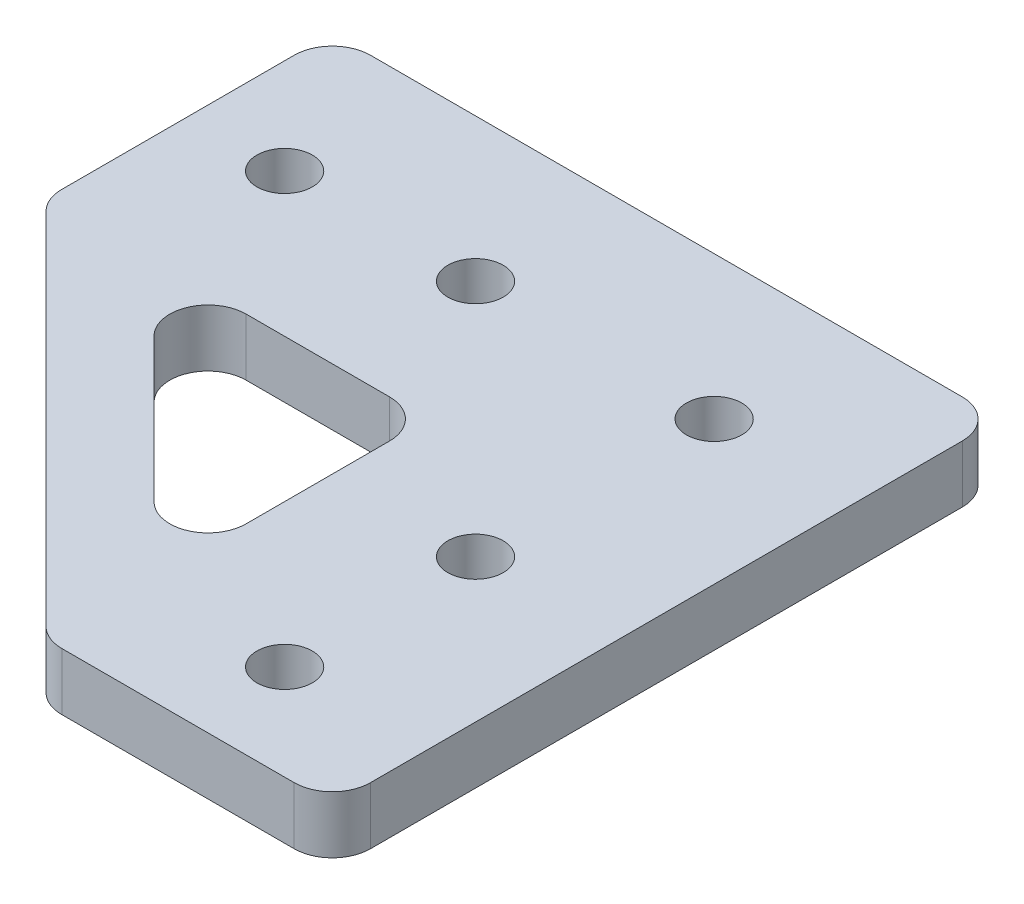
ISO-10303-21;
HEADER;
FILE_DESCRIPTION(('STEP AP214'),'2;1');
FILE_NAME('part.step','',(''),(''),'','','');
FILE_SCHEMA(('AUTOMOTIVE_DESIGN { 1 0 10303 214 1 1 1 1 }'));
ENDSEC;
DATA;
#1=APPLICATION_CONTEXT('core data for automotive mechanical design processes');
#2=APPLICATION_PROTOCOL_DEFINITION('international standard','automotive_design',2000,#1);
#3=PRODUCT_CONTEXT('',#1,'mechanical');
#4=PRODUCT('Part','Part','',(#3));
#5=PRODUCT_RELATED_PRODUCT_CATEGORY('part','',(#4));
#6=PRODUCT_DEFINITION_FORMATION('','',#4);
#7=PRODUCT_DEFINITION_CONTEXT('part definition',#1,'design');
#8=PRODUCT_DEFINITION('design','',#6,#7);
#9=PRODUCT_DEFINITION_SHAPE('','',#8);
#10=(LENGTH_UNIT() NAMED_UNIT(*) SI_UNIT(.MILLI.,.METRE.));
#11=(NAMED_UNIT(*) PLANE_ANGLE_UNIT() SI_UNIT($,.RADIAN.));
#12=(NAMED_UNIT(*) SI_UNIT($,.STERADIAN.) SOLID_ANGLE_UNIT());
#13=UNCERTAINTY_MEASURE_WITH_UNIT(LENGTH_MEASURE(1.E-05),#10,'distance_accuracy_value','');
#14=(GEOMETRIC_REPRESENTATION_CONTEXT(3) GLOBAL_UNCERTAINTY_ASSIGNED_CONTEXT((#13)) GLOBAL_UNIT_ASSIGNED_CONTEXT((#10,
#11,#12)) REPRESENTATION_CONTEXT('',''));
#15=CARTESIAN_POINT('',(0.,0.,0.));
#16=DIRECTION('',(0.,0.,1.));
#17=DIRECTION('',(1.,0.,0.));
#18=AXIS2_PLACEMENT_3D('',#15,#16,#17);
#19=CARTESIAN_POINT('',(0.,3.,0.));
#20=DIRECTION('',(0.,-1.,0.));
#21=DIRECTION('',(0.,0.,-1.));
#22=AXIS2_PLACEMENT_3D('',#19,#20,#21);
#23=PLANE('',#22);
#24=DIRECTION('',(0.,0.,1.));
#25=VECTOR('',#24,1.);
#26=CARTESIAN_POINT('',(-15.,3.,35.));
#27=LINE('',#26,#25);
#28=CARTESIAN_POINT('',(-15.,3.,17.));
#29=VERTEX_POINT('',#28);
#30=CARTESIAN_POINT('',(-15.,3.,24.5147186257614));
#31=VERTEX_POINT('',#30);
#32=EDGE_CURVE('E267',#29,#31,#27,.T.);
#33=ORIENTED_EDGE('',*,*,#32,.T.);
#34=CARTESIAN_POINT('',(-17.,3.,24.5147186257614));
#35=DIRECTION('',(0.,-1.,0.));
#36=DIRECTION('',(0.,0.,-1.));
#37=AXIS2_PLACEMENT_3D('',#34,#35,#36);
#38=CIRCLE('',#37,2.);
#39=CARTESIAN_POINT('',(-18.4142135623731,3.,25.9289321881345));
#40=VERTEX_POINT('',#39);
#41=EDGE_CURVE('E241',#31,#40,#38,.T.);
#42=ORIENTED_EDGE('',*,*,#41,.T.);
#43=DIRECTION('',(-0.707106781186548,0.,-0.707106781186547));
#44=VECTOR('',#43,1.);
#45=CARTESIAN_POINT('',(-15.,3.,29.3431457505076));
#46=LINE('',#45,#44);
#47=CARTESIAN_POINT('',(-25.9289321881345,3.,18.4142135623731));
#48=VERTEX_POINT('',#47);
#49=EDGE_CURVE('E298',#40,#48,#46,.T.);
#50=ORIENTED_EDGE('',*,*,#49,.T.);
#51=CARTESIAN_POINT('',(-24.5147186257614,3.,17.));
#52=DIRECTION('',(0.,-1.,0.));
#53=DIRECTION('',(0.,0.,-1.));
#54=AXIS2_PLACEMENT_3D('',#51,#52,#53);
#55=CIRCLE('',#54,2.);
#56=CARTESIAN_POINT('',(-24.5147186257614,3.,15.));
#57=VERTEX_POINT('',#56);
#58=EDGE_CURVE('E245',#48,#57,#55,.T.);
#59=ORIENTED_EDGE('',*,*,#58,.T.);
#60=DIRECTION('',(1.,0.,0.));
#61=VECTOR('',#60,1.);
#62=CARTESIAN_POINT('',(-35.,3.,15.));
#63=LINE('',#62,#61);
#64=CARTESIAN_POINT('',(-17.,3.,15.));
#65=VERTEX_POINT('',#64);
#66=EDGE_CURVE('E268',#57,#65,#63,.T.);
#67=ORIENTED_EDGE('',*,*,#66,.T.);
#68=CARTESIAN_POINT('',(-17.,3.,17.));
#69=DIRECTION('',(0.,-1.,0.));
#70=DIRECTION('',(0.,0.,-1.));
#71=AXIS2_PLACEMENT_3D('',#68,#69,#70);
#72=CIRCLE('',#71,2.);
#73=EDGE_CURVE('E11',#65,#29,#72,.T.);
#74=ORIENTED_EDGE('',*,*,#73,.T.);
#75=EDGE_LOOP('',(#33,#42,#50,#59,#67,#74));
#76=FACE_BOUND('',#75,.T.);
#77=DIRECTION('',(0.707106781186548,0.,0.707106781186547));
#78=VECTOR('',#77,1.);
#79=CARTESIAN_POINT('',(-35.,3.,15.));
#80=LINE('',#79,#78);
#81=CARTESIAN_POINT('',(-34.4142135623731,3.,15.5857864376269));
#82=VERTEX_POINT('',#81);
#83=CARTESIAN_POINT('',(-15.5857864376269,3.,34.4142135623731));
#84=VERTEX_POINT('',#83);
#85=EDGE_CURVE('E295',#82,#84,#80,.T.);
#86=ORIENTED_EDGE('',*,*,#85,.T.);
#87=CARTESIAN_POINT('',(-14.1715728752538,3.,33.));
#88=DIRECTION('',(0.,-1.,0.));
#89=DIRECTION('',(0.,0.,-1.));
#90=AXIS2_PLACEMENT_3D('',#87,#88,#89);
#91=CIRCLE('',#90,2.);
#92=CARTESIAN_POINT('',(-14.1715728752538,3.,35.));
#93=VERTEX_POINT('',#92);
#94=EDGE_CURVE('E210',#84,#93,#91,.F.);
#95=ORIENTED_EDGE('',*,*,#94,.T.);
#96=DIRECTION('',(1.,0.,0.));
#97=VECTOR('',#96,1.);
#98=CARTESIAN_POINT('',(0.,3.,35.));
#99=LINE('',#98,#97);
#100=CARTESIAN_POINT('',(-2.,3.,35.));
#101=VERTEX_POINT('',#100);
#102=EDGE_CURVE('E175',#93,#101,#99,.T.);
#103=ORIENTED_EDGE('',*,*,#102,.T.);
#104=CARTESIAN_POINT('',(-2.,3.,33.));
#105=DIRECTION('',(0.,-1.,0.));
#106=DIRECTION('',(0.,0.,-1.));
#107=AXIS2_PLACEMENT_3D('',#104,#105,#106);
#108=CIRCLE('',#107,2.);
#109=CARTESIAN_POINT('',(0.,3.,33.));
#110=VERTEX_POINT('',#109);
#111=EDGE_CURVE('E203',#101,#110,#108,.F.);
#112=ORIENTED_EDGE('',*,*,#111,.T.);
#113=DIRECTION('',(0.,0.,-1.));
#114=VECTOR('',#113,1.);
#115=CARTESIAN_POINT('',(0.,3.,0.));
#116=LINE('',#115,#114);
#117=CARTESIAN_POINT('',(0.,3.,2.));
#118=VERTEX_POINT('',#117);
#119=EDGE_CURVE('E182',#110,#118,#116,.T.);
#120=ORIENTED_EDGE('',*,*,#119,.T.);
#121=CARTESIAN_POINT('',(-2.,3.,2.));
#122=DIRECTION('',(0.,-1.,0.));
#123=DIRECTION('',(0.,0.,-1.));
#124=AXIS2_PLACEMENT_3D('',#121,#122,#123);
#125=CIRCLE('',#124,2.);
#126=CARTESIAN_POINT('',(-2.,3.,0.));
#127=VERTEX_POINT('',#126);
#128=EDGE_CURVE('E205',#118,#127,#125,.F.);
#129=ORIENTED_EDGE('',*,*,#128,.T.);
#130=DIRECTION('',(-1.,0.,0.));
#131=VECTOR('',#130,1.);
#132=CARTESIAN_POINT('',(0.,3.,0.));
#133=LINE('',#132,#131);
#134=CARTESIAN_POINT('',(-33.,3.,0.));
#135=VERTEX_POINT('',#134);
#136=EDGE_CURVE('E186',#127,#135,#133,.T.);
#137=ORIENTED_EDGE('',*,*,#136,.T.);
#138=CARTESIAN_POINT('',(-33.,3.,2.));
#139=DIRECTION('',(0.,-1.,0.));
#140=DIRECTION('',(0.,0.,-1.));
#141=AXIS2_PLACEMENT_3D('',#138,#139,#140);
#142=CIRCLE('',#141,2.);
#143=CARTESIAN_POINT('',(-35.,3.,2.));
#144=VERTEX_POINT('',#143);
#145=EDGE_CURVE('E63',#135,#144,#142,.F.);
#146=ORIENTED_EDGE('',*,*,#145,.T.);
#147=DIRECTION('',(0.,0.,1.));
#148=VECTOR('',#147,1.);
#149=CARTESIAN_POINT('',(-35.,3.,0.));
#150=LINE('',#149,#148);
#151=CARTESIAN_POINT('',(-35.,3.,14.1715728752538));
#152=VERTEX_POINT('',#151);
#153=EDGE_CURVE('E274',#144,#152,#150,.T.);
#154=ORIENTED_EDGE('',*,*,#153,.T.);
#155=CARTESIAN_POINT('',(-33.,3.,14.1715728752538));
#156=DIRECTION('',(0.,-1.,0.));
#157=DIRECTION('',(0.,0.,-1.));
#158=AXIS2_PLACEMENT_3D('',#155,#156,#157);
#159=CIRCLE('',#158,2.);
#160=EDGE_CURVE('E208',#152,#82,#159,.F.);
#161=ORIENTED_EDGE('',*,*,#160,.T.);
#162=EDGE_LOOP('',(#86,#95,#103,#112,#120,#129,#137,#146,#154,#161));
#163=FACE_BOUND('',#162,.T.);
#164=CARTESIAN_POINT('',(-7.50000000000001,3.,7.5));
#165=DIRECTION('',(0.,1.,0.));
#166=DIRECTION('',(0.,0.,1.));
#167=AXIS2_PLACEMENT_3D('',#164,#165,#166);
#168=CIRCLE('',#167,1.45);
#169=CARTESIAN_POINT('',(-7.50000000000001,3.,8.95));
#170=VERTEX_POINT('',#169);
#171=EDGE_CURVE('E282',#170,#170,#168,.T.);
#172=ORIENTED_EDGE('',*,*,#171,.F.);
#173=EDGE_LOOP('',(#172));
#174=FACE_BOUND('',#173,.T.);
#175=CARTESIAN_POINT('',(-20.,3.,7.50000000000001));
#176=DIRECTION('',(0.,1.,0.));
#177=DIRECTION('',(0.,0.,1.));
#178=AXIS2_PLACEMENT_3D('',#175,#176,#177);
#179=CIRCLE('',#178,1.45);
#180=CARTESIAN_POINT('',(-20.,3.,8.95000000000001));
#181=VERTEX_POINT('',#180);
#182=EDGE_CURVE('E326',#181,#181,#179,.T.);
#183=ORIENTED_EDGE('',*,*,#182,.F.);
#184=EDGE_LOOP('',(#183));
#185=FACE_BOUND('',#184,.T.);
#186=CARTESIAN_POINT('',(-30.,3.,7.50000000000001));
#187=DIRECTION('',(0.,1.,0.));
#188=DIRECTION('',(0.,0.,1.));
#189=AXIS2_PLACEMENT_3D('',#186,#187,#188);
#190=CIRCLE('',#189,1.45);
#191=CARTESIAN_POINT('',(-30.,3.,8.95000000000001));
#192=VERTEX_POINT('',#191);
#193=EDGE_CURVE('E320',#192,#192,#190,.T.);
#194=ORIENTED_EDGE('',*,*,#193,.F.);
#195=EDGE_LOOP('',(#194));
#196=FACE_BOUND('',#195,.T.);
#197=CARTESIAN_POINT('',(-7.5,3.,20.));
#198=DIRECTION('',(0.,1.,0.));
#199=DIRECTION('',(0.,0.,1.));
#200=AXIS2_PLACEMENT_3D('',#197,#198,#199);
#201=CIRCLE('',#200,1.45);
#202=CARTESIAN_POINT('',(-7.5,3.,21.45));
#203=VERTEX_POINT('',#202);
#204=EDGE_CURVE('E314',#203,#203,#201,.T.);
#205=ORIENTED_EDGE('',*,*,#204,.F.);
#206=EDGE_LOOP('',(#205));
#207=FACE_BOUND('',#206,.T.);
#208=CARTESIAN_POINT('',(-7.5,3.,30.));
#209=DIRECTION('',(0.,1.,0.));
#210=DIRECTION('',(0.,0.,1.));
#211=AXIS2_PLACEMENT_3D('',#208,#209,#210);
#212=CIRCLE('',#211,1.45);
#213=CARTESIAN_POINT('',(-7.5,3.,31.45));
#214=VERTEX_POINT('',#213);
#215=EDGE_CURVE('E307',#214,#214,#212,.T.);
#216=ORIENTED_EDGE('',*,*,#215,.F.);
#217=EDGE_LOOP('',(#216));
#218=FACE_BOUND('',#217,.T.);
#219=ADVANCED_FACE('F41',(#76,#163,#174,#185,#196,#207,#218),#23,.F.);
#220=CARTESIAN_POINT('',(0.,0.,0.));
#221=DIRECTION('',(0.,-1.,0.));
#222=DIRECTION('',(0.,0.,-1.));
#223=AXIS2_PLACEMENT_3D('',#220,#221,#222);
#224=PLANE('',#223);
#225=DIRECTION('',(1.,0.,0.));
#226=VECTOR('',#225,1.);
#227=CARTESIAN_POINT('',(-35.,0.,15.));
#228=LINE('',#227,#226);
#229=CARTESIAN_POINT('',(-24.5147186257614,0.,15.));
#230=VERTEX_POINT('',#229);
#231=CARTESIAN_POINT('',(-17.,0.,15.));
#232=VERTEX_POINT('',#231);
#233=EDGE_CURVE('E189',#230,#232,#228,.T.);
#234=ORIENTED_EDGE('',*,*,#233,.F.);
#235=CARTESIAN_POINT('',(-24.5147186257614,0.,17.));
#236=DIRECTION('',(0.,-1.,0.));
#237=DIRECTION('',(0.,0.,-1.));
#238=AXIS2_PLACEMENT_3D('',#235,#236,#237);
#239=CIRCLE('',#238,2.);
#240=CARTESIAN_POINT('',(-25.9289321881345,0.,18.4142135623731));
#241=VERTEX_POINT('',#240);
#242=EDGE_CURVE('E247',#230,#241,#239,.F.);
#243=ORIENTED_EDGE('',*,*,#242,.T.);
#244=DIRECTION('',(-0.707106781186548,0.,-0.707106781186547));
#245=VECTOR('',#244,1.);
#246=CARTESIAN_POINT('',(-15.,0.,29.3431457505076));
#247=LINE('',#246,#245);
#248=CARTESIAN_POINT('',(-18.4142135623731,0.,25.9289321881345));
#249=VERTEX_POINT('',#248);
#250=EDGE_CURVE('E304',#249,#241,#247,.T.);
#251=ORIENTED_EDGE('',*,*,#250,.F.);
#252=CARTESIAN_POINT('',(-17.,0.,24.5147186257614));
#253=DIRECTION('',(0.,-1.,0.));
#254=DIRECTION('',(0.,0.,-1.));
#255=AXIS2_PLACEMENT_3D('',#252,#253,#254);
#256=CIRCLE('',#255,2.);
#257=CARTESIAN_POINT('',(-15.,0.,24.5147186257614));
#258=VERTEX_POINT('',#257);
#259=EDGE_CURVE('E243',#249,#258,#256,.F.);
#260=ORIENTED_EDGE('',*,*,#259,.T.);
#261=DIRECTION('',(0.,0.,1.));
#262=VECTOR('',#261,1.);
#263=CARTESIAN_POINT('',(-15.,0.,35.));
#264=LINE('',#263,#262);
#265=CARTESIAN_POINT('',(-15.,0.,17.));
#266=VERTEX_POINT('',#265);
#267=EDGE_CURVE('E183',#266,#258,#264,.T.);
#268=ORIENTED_EDGE('',*,*,#267,.F.);
#269=CARTESIAN_POINT('',(-17.,0.,17.));
#270=DIRECTION('',(0.,-1.,0.));
#271=DIRECTION('',(0.,0.,-1.));
#272=AXIS2_PLACEMENT_3D('',#269,#270,#271);
#273=CIRCLE('',#272,2.);
#274=EDGE_CURVE('E49',#266,#232,#273,.F.);
#275=ORIENTED_EDGE('',*,*,#274,.T.);
#276=EDGE_LOOP('',(#234,#243,#251,#260,#268,#275));
#277=FACE_BOUND('',#276,.T.);
#278=CARTESIAN_POINT('',(-7.5,0.,20.));
#279=DIRECTION('',(0.,1.,0.));
#280=DIRECTION('',(0.,0.,1.));
#281=AXIS2_PLACEMENT_3D('',#278,#279,#280);
#282=CIRCLE('',#281,1.45);
#283=CARTESIAN_POINT('',(-7.5,0.,21.45));
#284=VERTEX_POINT('',#283);
#285=EDGE_CURVE('E310',#284,#284,#282,.T.);
#286=ORIENTED_EDGE('',*,*,#285,.T.);
#287=EDGE_LOOP('',(#286));
#288=FACE_BOUND('',#287,.T.);
#289=CARTESIAN_POINT('',(-20.,0.,7.50000000000001));
#290=DIRECTION('',(0.,1.,0.));
#291=DIRECTION('',(0.,0.,1.));
#292=AXIS2_PLACEMENT_3D('',#289,#290,#291);
#293=CIRCLE('',#292,1.45);
#294=CARTESIAN_POINT('',(-20.,0.,8.95000000000001));
#295=VERTEX_POINT('',#294);
#296=EDGE_CURVE('E323',#295,#295,#293,.T.);
#297=ORIENTED_EDGE('',*,*,#296,.T.);
#298=EDGE_LOOP('',(#297));
#299=FACE_BOUND('',#298,.T.);
#300=DIRECTION('',(1.,0.,0.));
#301=VECTOR('',#300,1.);
#302=CARTESIAN_POINT('',(0.,0.,35.));
#303=LINE('',#302,#301);
#304=CARTESIAN_POINT('',(-14.1715728752538,0.,35.));
#305=VERTEX_POINT('',#304);
#306=CARTESIAN_POINT('',(-2.,0.,35.));
#307=VERTEX_POINT('',#306);
#308=EDGE_CURVE('E172',#305,#307,#303,.T.);
#309=ORIENTED_EDGE('',*,*,#308,.F.);
#310=CARTESIAN_POINT('',(-14.1715728752538,0.,33.));
#311=DIRECTION('',(0.,-1.,0.));
#312=DIRECTION('',(0.,0.,-1.));
#313=AXIS2_PLACEMENT_3D('',#310,#311,#312);
#314=CIRCLE('',#313,2.);
#315=CARTESIAN_POINT('',(-15.5857864376269,0.,34.4142135623731));
#316=VERTEX_POINT('',#315);
#317=EDGE_CURVE('E155',#305,#316,#314,.T.);
#318=ORIENTED_EDGE('',*,*,#317,.T.);
#319=DIRECTION('',(0.707106781186548,0.,0.707106781186547));
#320=VECTOR('',#319,1.);
#321=CARTESIAN_POINT('',(-35.,0.,15.));
#322=LINE('',#321,#320);
#323=CARTESIAN_POINT('',(-34.4142135623731,0.,15.5857864376269));
#324=VERTEX_POINT('',#323);
#325=EDGE_CURVE('E301',#324,#316,#322,.T.);
#326=ORIENTED_EDGE('',*,*,#325,.F.);
#327=CARTESIAN_POINT('',(-33.,0.,14.1715728752538));
#328=DIRECTION('',(0.,-1.,0.));
#329=DIRECTION('',(0.,0.,-1.));
#330=AXIS2_PLACEMENT_3D('',#327,#328,#329);
#331=CIRCLE('',#330,2.);
#332=CARTESIAN_POINT('',(-35.,0.,14.1715728752538));
#333=VERTEX_POINT('',#332);
#334=EDGE_CURVE('E166',#324,#333,#331,.T.);
#335=ORIENTED_EDGE('',*,*,#334,.T.);
#336=DIRECTION('',(0.,0.,1.));
#337=VECTOR('',#336,1.);
#338=CARTESIAN_POINT('',(-35.,0.,0.));
#339=LINE('',#338,#337);
#340=CARTESIAN_POINT('',(-35.,0.,2.));
#341=VERTEX_POINT('',#340);
#342=EDGE_CURVE('E262',#341,#333,#339,.T.);
#343=ORIENTED_EDGE('',*,*,#342,.F.);
#344=CARTESIAN_POINT('',(-33.,0.,2.));
#345=DIRECTION('',(0.,-1.,0.));
#346=DIRECTION('',(0.,0.,-1.));
#347=AXIS2_PLACEMENT_3D('',#344,#345,#346);
#348=CIRCLE('',#347,2.);
#349=CARTESIAN_POINT('',(-33.,0.,0.));
#350=VERTEX_POINT('',#349);
#351=EDGE_CURVE('E197',#341,#350,#348,.T.);
#352=ORIENTED_EDGE('',*,*,#351,.T.);
#353=DIRECTION('',(-1.,0.,0.));
#354=VECTOR('',#353,1.);
#355=CARTESIAN_POINT('',(0.,0.,0.));
#356=LINE('',#355,#354);
#357=CARTESIAN_POINT('',(-2.,0.,0.));
#358=VERTEX_POINT('',#357);
#359=EDGE_CURVE('E281',#358,#350,#356,.T.);
#360=ORIENTED_EDGE('',*,*,#359,.F.);
#361=CARTESIAN_POINT('',(-2.,0.,2.));
#362=DIRECTION('',(0.,-1.,0.));
#363=DIRECTION('',(0.,0.,-1.));
#364=AXIS2_PLACEMENT_3D('',#361,#362,#363);
#365=CIRCLE('',#364,2.);
#366=CARTESIAN_POINT('',(0.,0.,2.));
#367=VERTEX_POINT('',#366);
#368=EDGE_CURVE('E195',#358,#367,#365,.T.);
#369=ORIENTED_EDGE('',*,*,#368,.T.);
#370=DIRECTION('',(0.,0.,-1.));
#371=VECTOR('',#370,1.);
#372=CARTESIAN_POINT('',(0.,0.,0.));
#373=LINE('',#372,#371);
#374=CARTESIAN_POINT('',(0.,0.,33.));
#375=VERTEX_POINT('',#374);
#376=EDGE_CURVE('E278',#375,#367,#373,.T.);
#377=ORIENTED_EDGE('',*,*,#376,.F.);
#378=CARTESIAN_POINT('',(-2.,0.,33.));
#379=DIRECTION('',(0.,-1.,0.));
#380=DIRECTION('',(0.,0.,-1.));
#381=AXIS2_PLACEMENT_3D('',#378,#379,#380);
#382=CIRCLE('',#381,2.);
#383=EDGE_CURVE('E176',#375,#307,#382,.T.);
#384=ORIENTED_EDGE('',*,*,#383,.T.);
#385=EDGE_LOOP('',(#309,#318,#326,#335,#343,#352,#360,#369,#377,#384));
#386=FACE_BOUND('',#385,.T.);
#387=CARTESIAN_POINT('',(-7.50000000000001,0.,7.5));
#388=DIRECTION('',(0.,1.,0.));
#389=DIRECTION('',(0.,0.,1.));
#390=AXIS2_PLACEMENT_3D('',#387,#388,#389);
#391=CIRCLE('',#390,1.45);
#392=CARTESIAN_POINT('',(-7.50000000000001,0.,8.95));
#393=VERTEX_POINT('',#392);
#394=EDGE_CURVE('E329',#393,#393,#391,.T.);
#395=ORIENTED_EDGE('',*,*,#394,.T.);
#396=EDGE_LOOP('',(#395));
#397=FACE_BOUND('',#396,.T.);
#398=CARTESIAN_POINT('',(-30.,0.,7.50000000000001));
#399=DIRECTION('',(0.,1.,0.));
#400=DIRECTION('',(0.,0.,1.));
#401=AXIS2_PLACEMENT_3D('',#398,#399,#400);
#402=CIRCLE('',#401,1.45);
#403=CARTESIAN_POINT('',(-30.,0.,8.95000000000001));
#404=VERTEX_POINT('',#403);
#405=EDGE_CURVE('E317',#404,#404,#402,.T.);
#406=ORIENTED_EDGE('',*,*,#405,.T.);
#407=EDGE_LOOP('',(#406));
#408=FACE_BOUND('',#407,.T.);
#409=CARTESIAN_POINT('',(-7.5,0.,30.));
#410=DIRECTION('',(0.,1.,0.));
#411=DIRECTION('',(0.,0.,1.));
#412=AXIS2_PLACEMENT_3D('',#409,#410,#411);
#413=CIRCLE('',#412,1.45);
#414=CARTESIAN_POINT('',(-7.5,0.,31.45));
#415=VERTEX_POINT('',#414);
#416=EDGE_CURVE('E311',#415,#415,#413,.T.);
#417=ORIENTED_EDGE('',*,*,#416,.T.);
#418=EDGE_LOOP('',(#417));
#419=FACE_BOUND('',#418,.T.);
#420=ADVANCED_FACE('F179',(#277,#288,#299,#386,#397,#408,#419),#224,.T.);
#421=CARTESIAN_POINT('',(0.,3.,0.));
#422=DIRECTION('',(-1.,0.,0.));
#423=DIRECTION('',(0.,0.,1.));
#424=AXIS2_PLACEMENT_3D('',#421,#422,#423);
#425=PLANE('',#424);
#426=ORIENTED_EDGE('',*,*,#376,.T.);
#427=DIRECTION('',(0.,-1.,0.));
#428=VECTOR('',#427,1.);
#429=CARTESIAN_POINT('',(0.,3.,2.));
#430=LINE('',#429,#428);
#431=EDGE_CURVE('E224',#367,#118,#430,.F.);
#432=ORIENTED_EDGE('',*,*,#431,.T.);
#433=ORIENTED_EDGE('',*,*,#119,.F.);
#434=DIRECTION('',(0.,-1.,0.));
#435=VECTOR('',#434,1.);
#436=CARTESIAN_POINT('',(0.,3.,33.));
#437=LINE('',#436,#435);
#438=EDGE_CURVE('E221',#110,#375,#437,.T.);
#439=ORIENTED_EDGE('',*,*,#438,.T.);
#440=EDGE_LOOP('',(#426,#432,#433,#439));
#441=FACE_BOUND('',#440,.T.);
#442=ADVANCED_FACE('F349',(#441),#425,.F.);
#443=CARTESIAN_POINT('',(0.,3.,0.));
#444=DIRECTION('',(0.,0.,1.));
#445=DIRECTION('',(1.,0.,0.));
#446=AXIS2_PLACEMENT_3D('',#443,#444,#445);
#447=PLANE('',#446);
#448=ORIENTED_EDGE('',*,*,#359,.T.);
#449=DIRECTION('',(0.,-1.,0.));
#450=VECTOR('',#449,1.);
#451=CARTESIAN_POINT('',(-33.,3.,0.));
#452=LINE('',#451,#450);
#453=EDGE_CURVE('E219',#350,#135,#452,.F.);
#454=ORIENTED_EDGE('',*,*,#453,.T.);
#455=ORIENTED_EDGE('',*,*,#136,.F.);
#456=DIRECTION('',(0.,-1.,0.));
#457=VECTOR('',#456,1.);
#458=CARTESIAN_POINT('',(-2.,3.,0.));
#459=LINE('',#458,#457);
#460=EDGE_CURVE('E216',#127,#358,#459,.T.);
#461=ORIENTED_EDGE('',*,*,#460,.T.);
#462=EDGE_LOOP('',(#448,#454,#455,#461));
#463=FACE_BOUND('',#462,.T.);
#464=ADVANCED_FACE('F344',(#463),#447,.F.);
#465=CARTESIAN_POINT('',(-35.,3.,0.));
#466=DIRECTION('',(1.,0.,0.));
#467=DIRECTION('',(0.,0.,-1.));
#468=AXIS2_PLACEMENT_3D('',#465,#466,#467);
#469=PLANE('',#468);
#470=ORIENTED_EDGE('',*,*,#342,.T.);
#471=DIRECTION('',(0.,-1.,0.));
#472=VECTOR('',#471,1.);
#473=CARTESIAN_POINT('',(-35.,3.,14.1715728752538));
#474=LINE('',#473,#472);
#475=EDGE_CURVE('E56',#333,#152,#474,.F.);
#476=ORIENTED_EDGE('',*,*,#475,.T.);
#477=ORIENTED_EDGE('',*,*,#153,.F.);
#478=DIRECTION('',(0.,-1.,0.));
#479=VECTOR('',#478,1.);
#480=CARTESIAN_POINT('',(-35.,3.,2.));
#481=LINE('',#480,#479);
#482=EDGE_CURVE('E212',#144,#341,#481,.T.);
#483=ORIENTED_EDGE('',*,*,#482,.T.);
#484=EDGE_LOOP('',(#470,#476,#477,#483));
#485=FACE_BOUND('',#484,.T.);
#486=ADVANCED_FACE('F286',(#485),#469,.F.);
#487=CARTESIAN_POINT('',(-35.,3.,15.));
#488=DIRECTION('',(0.,0.,-1.));
#489=DIRECTION('',(-1.,0.,0.));
#490=AXIS2_PLACEMENT_3D('',#487,#488,#489);
#491=PLANE('',#490);
#492=ORIENTED_EDGE('',*,*,#66,.F.);
#493=DIRECTION('',(0.,1.,0.));
#494=VECTOR('',#493,1.);
#495=CARTESIAN_POINT('',(-24.5147186257614,3.,15.));
#496=LINE('',#495,#494);
#497=EDGE_CURVE('E239',#57,#230,#496,.F.);
#498=ORIENTED_EDGE('',*,*,#497,.T.);
#499=ORIENTED_EDGE('',*,*,#233,.T.);
#500=DIRECTION('',(0.,-1.,0.));
#501=VECTOR('',#500,1.);
#502=CARTESIAN_POINT('',(-17.,3.,15.));
#503=LINE('',#502,#501);
#504=EDGE_CURVE('E237',#232,#65,#503,.F.);
#505=ORIENTED_EDGE('',*,*,#504,.T.);
#506=EDGE_LOOP('',(#492,#498,#499,#505));
#507=FACE_BOUND('',#506,.T.);
#508=ADVANCED_FACE('F259',(#507),#491,.F.);
#509=CARTESIAN_POINT('',(-15.,3.,35.));
#510=DIRECTION('',(1.,0.,0.));
#511=DIRECTION('',(0.,0.,-1.));
#512=AXIS2_PLACEMENT_3D('',#509,#510,#511);
#513=PLANE('',#512);
#514=ORIENTED_EDGE('',*,*,#267,.T.);
#515=DIRECTION('',(0.,1.,0.));
#516=VECTOR('',#515,1.);
#517=CARTESIAN_POINT('',(-15.,3.,24.5147186257614));
#518=LINE('',#517,#516);
#519=EDGE_CURVE('E229',#258,#31,#518,.T.);
#520=ORIENTED_EDGE('',*,*,#519,.T.);
#521=ORIENTED_EDGE('',*,*,#32,.F.);
#522=DIRECTION('',(0.,-1.,0.));
#523=VECTOR('',#522,1.);
#524=CARTESIAN_POINT('',(-15.,0.,17.));
#525=LINE('',#524,#523);
#526=EDGE_CURVE('E226',#29,#266,#525,.T.);
#527=ORIENTED_EDGE('',*,*,#526,.T.);
#528=EDGE_LOOP('',(#514,#520,#521,#527));
#529=FACE_BOUND('',#528,.T.);
#530=ADVANCED_FACE('F270',(#529),#513,.F.);
#531=CARTESIAN_POINT('',(0.,3.,35.));
#532=DIRECTION('',(0.,0.,-1.));
#533=DIRECTION('',(-1.,0.,0.));
#534=AXIS2_PLACEMENT_3D('',#531,#532,#533);
#535=PLANE('',#534);
#536=ORIENTED_EDGE('',*,*,#102,.F.);
#537=DIRECTION('',(0.,-1.,0.));
#538=VECTOR('',#537,1.);
#539=CARTESIAN_POINT('',(-14.1715728752538,0.,35.));
#540=LINE('',#539,#538);
#541=EDGE_CURVE('E159',#93,#305,#540,.T.);
#542=ORIENTED_EDGE('',*,*,#541,.T.);
#543=ORIENTED_EDGE('',*,*,#308,.T.);
#544=DIRECTION('',(0.,-1.,0.));
#545=VECTOR('',#544,1.);
#546=CARTESIAN_POINT('',(-2.,3.,35.));
#547=LINE('',#546,#545);
#548=EDGE_CURVE('E177',#307,#101,#547,.F.);
#549=ORIENTED_EDGE('',*,*,#548,.T.);
#550=EDGE_LOOP('',(#536,#542,#543,#549));
#551=FACE_BOUND('',#550,.T.);
#552=ADVANCED_FACE('F171',(#551),#535,.F.);
#553=CARTESIAN_POINT('',(-7.50000000000001,3.,7.5));
#554=DIRECTION('',(0.,-1.,0.));
#555=DIRECTION('',(0.,0.,-1.));
#556=AXIS2_PLACEMENT_3D('',#553,#554,#555);
#557=CYLINDRICAL_SURFACE('',#556,1.45);
#558=ORIENTED_EDGE('',*,*,#171,.T.);
#559=EDGE_LOOP('',(#558));
#560=FACE_BOUND('',#559,.T.);
#561=ORIENTED_EDGE('',*,*,#394,.F.);
#562=EDGE_LOOP('',(#561));
#563=FACE_BOUND('',#562,.T.);
#564=ADVANCED_FACE('F374',(#560,#563),#557,.F.);
#565=CARTESIAN_POINT('',(-20.,3.,7.50000000000001));
#566=DIRECTION('',(0.,-1.,0.));
#567=DIRECTION('',(0.,0.,-1.));
#568=AXIS2_PLACEMENT_3D('',#565,#566,#567);
#569=CYLINDRICAL_SURFACE('',#568,1.45);
#570=ORIENTED_EDGE('',*,*,#182,.T.);
#571=EDGE_LOOP('',(#570));
#572=FACE_BOUND('',#571,.T.);
#573=ORIENTED_EDGE('',*,*,#296,.F.);
#574=EDGE_LOOP('',(#573));
#575=FACE_BOUND('',#574,.T.);
#576=ADVANCED_FACE('F456',(#572,#575),#569,.F.);
#577=CARTESIAN_POINT('',(-30.,3.,7.50000000000001));
#578=DIRECTION('',(0.,-1.,0.));
#579=DIRECTION('',(0.,0.,-1.));
#580=AXIS2_PLACEMENT_3D('',#577,#578,#579);
#581=CYLINDRICAL_SURFACE('',#580,1.45);
#582=ORIENTED_EDGE('',*,*,#193,.T.);
#583=EDGE_LOOP('',(#582));
#584=FACE_BOUND('',#583,.T.);
#585=ORIENTED_EDGE('',*,*,#405,.F.);
#586=EDGE_LOOP('',(#585));
#587=FACE_BOUND('',#586,.T.);
#588=ADVANCED_FACE('F453',(#584,#587),#581,.F.);
#589=CARTESIAN_POINT('',(-7.5,3.,20.));
#590=DIRECTION('',(0.,-1.,0.));
#591=DIRECTION('',(0.,0.,-1.));
#592=AXIS2_PLACEMENT_3D('',#589,#590,#591);
#593=CYLINDRICAL_SURFACE('',#592,1.45);
#594=ORIENTED_EDGE('',*,*,#204,.T.);
#595=EDGE_LOOP('',(#594));
#596=FACE_BOUND('',#595,.T.);
#597=ORIENTED_EDGE('',*,*,#285,.F.);
#598=EDGE_LOOP('',(#597));
#599=FACE_BOUND('',#598,.T.);
#600=ADVANCED_FACE('F447',(#596,#599),#593,.F.);
#601=CARTESIAN_POINT('',(-7.5,3.,30.));
#602=DIRECTION('',(0.,-1.,0.));
#603=DIRECTION('',(0.,0.,-1.));
#604=AXIS2_PLACEMENT_3D('',#601,#602,#603);
#605=CYLINDRICAL_SURFACE('',#604,1.45);
#606=ORIENTED_EDGE('',*,*,#215,.T.);
#607=EDGE_LOOP('',(#606));
#608=FACE_BOUND('',#607,.T.);
#609=ORIENTED_EDGE('',*,*,#416,.F.);
#610=EDGE_LOOP('',(#609));
#611=FACE_BOUND('',#610,.T.);
#612=ADVANCED_FACE('F441',(#608,#611),#605,.F.);
#613=CARTESIAN_POINT('',(-15.,0.,29.3431457505076));
#614=DIRECTION('',(0.707106781186547,0.,-0.707106781186548));
#615=DIRECTION('',(-0.707106781186548,0.,-0.707106781186547));
#616=AXIS2_PLACEMENT_3D('',#613,#614,#615);
#617=PLANE('',#616);
#618=ORIENTED_EDGE('',*,*,#49,.F.);
#619=DIRECTION('',(0.,1.,0.));
#620=VECTOR('',#619,1.);
#621=CARTESIAN_POINT('',(-18.4142135623731,0.,25.9289321881345));
#622=LINE('',#621,#620);
#623=EDGE_CURVE('E235',#40,#249,#622,.F.);
#624=ORIENTED_EDGE('',*,*,#623,.T.);
#625=ORIENTED_EDGE('',*,*,#250,.T.);
#626=DIRECTION('',(0.,1.,0.));
#627=VECTOR('',#626,1.);
#628=CARTESIAN_POINT('',(-25.9289321881345,0.,18.4142135623731));
#629=LINE('',#628,#627);
#630=EDGE_CURVE('E232',#241,#48,#629,.T.);
#631=ORIENTED_EDGE('',*,*,#630,.T.);
#632=EDGE_LOOP('',(#618,#624,#625,#631));
#633=FACE_BOUND('',#632,.T.);
#634=ADVANCED_FACE('F438',(#633),#617,.T.);
#635=CARTESIAN_POINT('',(-35.,0.,15.));
#636=DIRECTION('',(-0.707106781186547,0.,0.707106781186548));
#637=DIRECTION('',(0.707106781186548,0.,0.707106781186547));
#638=AXIS2_PLACEMENT_3D('',#635,#636,#637);
#639=PLANE('',#638);
#640=ORIENTED_EDGE('',*,*,#325,.T.);
#641=DIRECTION('',(0.,-1.,0.));
#642=VECTOR('',#641,1.);
#643=CARTESIAN_POINT('',(-15.5857864376269,3.,34.4142135623731));
#644=LINE('',#643,#642);
#645=EDGE_CURVE('E160',#316,#84,#644,.F.);
#646=ORIENTED_EDGE('',*,*,#645,.T.);
#647=ORIENTED_EDGE('',*,*,#85,.F.);
#648=DIRECTION('',(0.,-1.,0.));
#649=VECTOR('',#648,1.);
#650=CARTESIAN_POINT('',(-34.4142135623731,0.,15.5857864376269));
#651=LINE('',#650,#649);
#652=EDGE_CURVE('E165',#82,#324,#651,.T.);
#653=ORIENTED_EDGE('',*,*,#652,.T.);
#654=EDGE_LOOP('',(#640,#646,#647,#653));
#655=FACE_BOUND('',#654,.T.);
#656=ADVANCED_FACE('F297',(#655),#639,.T.);
#657=CARTESIAN_POINT('',(-14.1715728752538,3.,33.));
#658=DIRECTION('',(0.,1.,0.));
#659=DIRECTION('',(0.,0.,1.));
#660=AXIS2_PLACEMENT_3D('',#657,#658,#659);
#661=CYLINDRICAL_SURFACE('',#660,2.);
#662=ORIENTED_EDGE('',*,*,#94,.F.);
#663=ORIENTED_EDGE('',*,*,#645,.F.);
#664=ORIENTED_EDGE('',*,*,#317,.F.);
#665=ORIENTED_EDGE('',*,*,#541,.F.);
#666=EDGE_LOOP('',(#662,#663,#664,#665));
#667=FACE_BOUND('',#666,.T.);
#668=ADVANCED_FACE('F158',(#667),#661,.T.);
#669=CARTESIAN_POINT('',(-33.,0.,14.1715728752538));
#670=DIRECTION('',(0.,1.,0.));
#671=DIRECTION('',(0.,0.,1.));
#672=AXIS2_PLACEMENT_3D('',#669,#670,#671);
#673=CYLINDRICAL_SURFACE('',#672,2.);
#674=ORIENTED_EDGE('',*,*,#160,.F.);
#675=ORIENTED_EDGE('',*,*,#475,.F.);
#676=ORIENTED_EDGE('',*,*,#334,.F.);
#677=ORIENTED_EDGE('',*,*,#652,.F.);
#678=EDGE_LOOP('',(#674,#675,#676,#677));
#679=FACE_BOUND('',#678,.T.);
#680=ADVANCED_FACE('F290',(#679),#673,.T.);
#681=CARTESIAN_POINT('',(-33.,3.,2.));
#682=DIRECTION('',(0.,-1.,0.));
#683=DIRECTION('',(0.,0.,-1.));
#684=AXIS2_PLACEMENT_3D('',#681,#682,#683);
#685=CYLINDRICAL_SURFACE('',#684,2.);
#686=ORIENTED_EDGE('',*,*,#145,.F.);
#687=ORIENTED_EDGE('',*,*,#453,.F.);
#688=ORIENTED_EDGE('',*,*,#351,.F.);
#689=ORIENTED_EDGE('',*,*,#482,.F.);
#690=EDGE_LOOP('',(#686,#687,#688,#689));
#691=FACE_BOUND('',#690,.T.);
#692=ADVANCED_FACE('F342',(#691),#685,.T.);
#693=CARTESIAN_POINT('',(-2.,3.,2.));
#694=DIRECTION('',(0.,-1.,0.));
#695=DIRECTION('',(0.,0.,-1.));
#696=AXIS2_PLACEMENT_3D('',#693,#694,#695);
#697=CYLINDRICAL_SURFACE('',#696,2.);
#698=ORIENTED_EDGE('',*,*,#128,.F.);
#699=ORIENTED_EDGE('',*,*,#431,.F.);
#700=ORIENTED_EDGE('',*,*,#368,.F.);
#701=ORIENTED_EDGE('',*,*,#460,.F.);
#702=EDGE_LOOP('',(#698,#699,#700,#701));
#703=FACE_BOUND('',#702,.T.);
#704=ADVANCED_FACE('F346',(#703),#697,.T.);
#705=CARTESIAN_POINT('',(-2.,3.,33.));
#706=DIRECTION('',(0.,-1.,0.));
#707=DIRECTION('',(0.,0.,-1.));
#708=AXIS2_PLACEMENT_3D('',#705,#706,#707);
#709=CYLINDRICAL_SURFACE('',#708,2.);
#710=ORIENTED_EDGE('',*,*,#111,.F.);
#711=ORIENTED_EDGE('',*,*,#548,.F.);
#712=ORIENTED_EDGE('',*,*,#383,.F.);
#713=ORIENTED_EDGE('',*,*,#438,.F.);
#714=EDGE_LOOP('',(#710,#711,#712,#713));
#715=FACE_BOUND('',#714,.T.);
#716=ADVANCED_FACE('F354',(#715),#709,.T.);
#717=CARTESIAN_POINT('',(-17.,3.,24.5147186257614));
#718=DIRECTION('',(0.,1.,0.));
#719=DIRECTION('',(0.,0.,1.));
#720=AXIS2_PLACEMENT_3D('',#717,#718,#719);
#721=CYLINDRICAL_SURFACE('',#720,2.);
#722=ORIENTED_EDGE('',*,*,#259,.F.);
#723=ORIENTED_EDGE('',*,*,#623,.F.);
#724=ORIENTED_EDGE('',*,*,#41,.F.);
#725=ORIENTED_EDGE('',*,*,#519,.F.);
#726=EDGE_LOOP('',(#722,#723,#724,#725));
#727=FACE_BOUND('',#726,.T.);
#728=ADVANCED_FACE('F356',(#727),#721,.F.);
#729=CARTESIAN_POINT('',(-24.5147186257614,0.,17.));
#730=DIRECTION('',(0.,1.,0.));
#731=DIRECTION('',(0.,0.,1.));
#732=AXIS2_PLACEMENT_3D('',#729,#730,#731);
#733=CYLINDRICAL_SURFACE('',#732,2.);
#734=ORIENTED_EDGE('',*,*,#242,.F.);
#735=ORIENTED_EDGE('',*,*,#497,.F.);
#736=ORIENTED_EDGE('',*,*,#58,.F.);
#737=ORIENTED_EDGE('',*,*,#630,.F.);
#738=EDGE_LOOP('',(#734,#735,#736,#737));
#739=FACE_BOUND('',#738,.T.);
#740=ADVANCED_FACE('F362',(#739),#733,.F.);
#741=CARTESIAN_POINT('',(-17.,3.,17.));
#742=DIRECTION('',(0.,1.,0.));
#743=DIRECTION('',(0.,0.,1.));
#744=AXIS2_PLACEMENT_3D('',#741,#742,#743);
#745=CYLINDRICAL_SURFACE('',#744,2.);
#746=ORIENTED_EDGE('',*,*,#73,.F.);
#747=ORIENTED_EDGE('',*,*,#504,.F.);
#748=ORIENTED_EDGE('',*,*,#274,.F.);
#749=ORIENTED_EDGE('',*,*,#526,.F.);
#750=EDGE_LOOP('',(#746,#747,#748,#749));
#751=FACE_BOUND('',#750,.T.);
#752=ADVANCED_FACE('F43',(#751),#745,.F.);
#753=CLOSED_SHELL('',(#219,#420,#442,#464,#486,#508,#530,#552,#564,#576,#588,#600,#612,#634,
#656,#668,#680,#692,#704,#716,#728,#740,#752));
#754=MANIFOLD_SOLID_BREP('B2',#753);
#755=ADVANCED_BREP_SHAPE_REPRESENTATION('',(#18,#754),#14);
#756=SHAPE_DEFINITION_REPRESENTATION(#9,#755);
ENDSEC;
END-ISO-10303-21;
